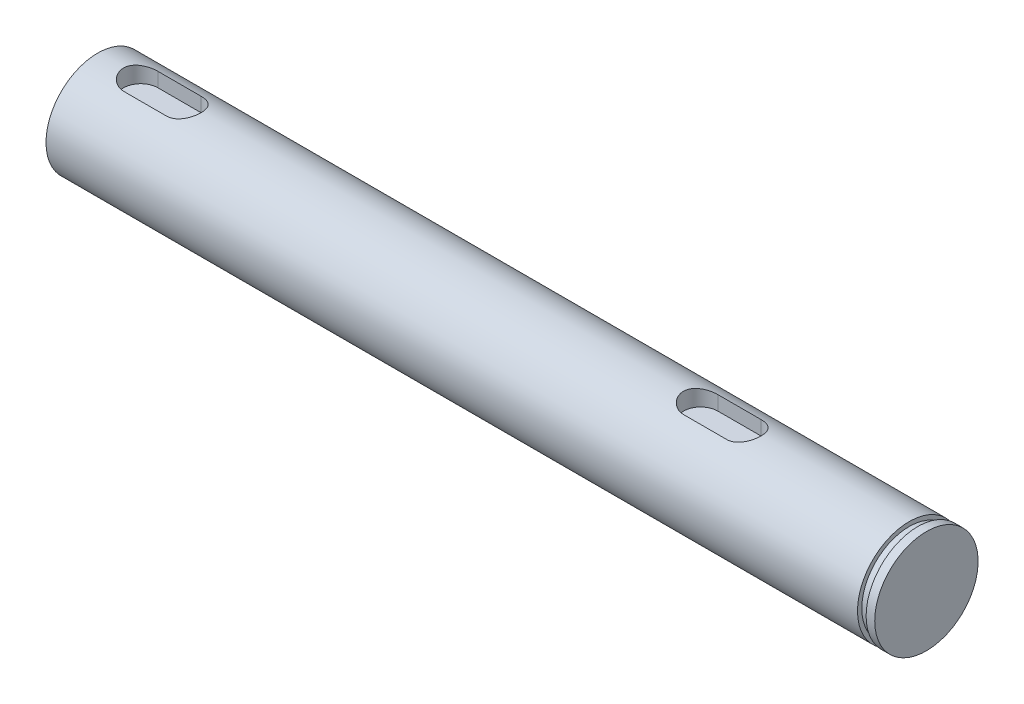
ISO-10303-21;
HEADER;
FILE_DESCRIPTION(('STEP AP214'),'2;1');
FILE_NAME('part.step','',(''),(''),'','','');
FILE_SCHEMA(('AUTOMOTIVE_DESIGN { 1 0 10303 214 1 1 1 1 }'));
ENDSEC;
DATA;
#1=APPLICATION_CONTEXT('core data for automotive mechanical design processes');
#2=APPLICATION_PROTOCOL_DEFINITION('international standard','automotive_design',2000,#1);
#3=PRODUCT_CONTEXT('',#1,'mechanical');
#4=PRODUCT('Part','Part','',(#3));
#5=PRODUCT_RELATED_PRODUCT_CATEGORY('part','',(#4));
#6=PRODUCT_DEFINITION_FORMATION('','',#4);
#7=PRODUCT_DEFINITION_CONTEXT('part definition',#1,'design');
#8=PRODUCT_DEFINITION('design','',#6,#7);
#9=PRODUCT_DEFINITION_SHAPE('','',#8);
#10=(LENGTH_UNIT() NAMED_UNIT(*) SI_UNIT(.MILLI.,.METRE.));
#11=(NAMED_UNIT(*) PLANE_ANGLE_UNIT() SI_UNIT($,.RADIAN.));
#12=(NAMED_UNIT(*) SI_UNIT($,.STERADIAN.) SOLID_ANGLE_UNIT());
#13=UNCERTAINTY_MEASURE_WITH_UNIT(LENGTH_MEASURE(1.E-05),#10,'distance_accuracy_value','');
#14=(GEOMETRIC_REPRESENTATION_CONTEXT(3) GLOBAL_UNCERTAINTY_ASSIGNED_CONTEXT((#13)) GLOBAL_UNIT_ASSIGNED_CONTEXT((#10,
#11,#12)) REPRESENTATION_CONTEXT('',''));
#15=CARTESIAN_POINT('',(0.,0.,0.));
#16=DIRECTION('',(0.,0.,1.));
#17=DIRECTION('',(1.,0.,0.));
#18=AXIS2_PLACEMENT_3D('',#15,#16,#17);
#19=CARTESIAN_POINT('',(0.,0.,0.));
#20=DIRECTION('',(-1.,0.,0.));
#21=DIRECTION('',(0.,0.,1.));
#22=AXIS2_PLACEMENT_3D('',#19,#20,#21);
#23=CYLINDRICAL_SURFACE('',#22,6.);
#24=CARTESIAN_POINT('',(96.2,0.,0.));
#25=DIRECTION('',(-1.,0.,0.));
#26=DIRECTION('',(0.,0.,1.));
#27=AXIS2_PLACEMENT_3D('',#24,#25,#26);
#28=CIRCLE('',#27,6.);
#29=CARTESIAN_POINT('',(96.2,0.,6.));
#30=VERTEX_POINT('',#29);
#31=EDGE_CURVE('E146',#30,#30,#28,.T.);
#32=ORIENTED_EDGE('',*,*,#31,.T.);
#33=EDGE_LOOP('',(#32));
#34=FACE_BOUND('',#33,.T.);
#35=CARTESIAN_POINT('',(95.2,0.,0.));
#36=DIRECTION('',(-1.,0.,0.));
#37=DIRECTION('',(0.,0.,1.));
#38=AXIS2_PLACEMENT_3D('',#35,#36,#37);
#39=CIRCLE('',#38,6.);
#40=CARTESIAN_POINT('',(95.2,0.,6.));
#41=VERTEX_POINT('',#40);
#42=EDGE_CURVE('E168',#41,#41,#39,.T.);
#43=ORIENTED_EDGE('',*,*,#42,.F.);
#44=EDGE_LOOP('',(#43));
#45=FACE_BOUND('',#44,.T.);
#46=ADVANCED_FACE('F36',(#34,#45),#23,.T.);
#47=CARTESIAN_POINT('',(95.2,0.,0.));
#48=DIRECTION('',(1.,0.,0.));
#49=DIRECTION('',(0.,0.,-1.));
#50=AXIS2_PLACEMENT_3D('',#47,#48,#49);
#51=PLANE('',#50);
#52=CARTESIAN_POINT('',(95.2,0.,0.));
#53=DIRECTION('',(-1.,0.,0.));
#54=DIRECTION('',(0.,0.,1.));
#55=AXIS2_PLACEMENT_3D('',#52,#53,#54);
#56=CIRCLE('',#55,5.5);
#57=CARTESIAN_POINT('',(95.2,0.,5.5));
#58=VERTEX_POINT('',#57);
#59=EDGE_CURVE('E165',#58,#58,#56,.T.);
#60=ORIENTED_EDGE('',*,*,#59,.F.);
#61=EDGE_LOOP('',(#60));
#62=FACE_BOUND('',#61,.T.);
#63=ORIENTED_EDGE('',*,*,#42,.T.);
#64=EDGE_LOOP('',(#63));
#65=FACE_BOUND('',#64,.T.);
#66=ADVANCED_FACE('F38',(#62,#65),#51,.F.);
#67=CARTESIAN_POINT('',(0.,0.,0.));
#68=DIRECTION('',(-1.,0.,0.));
#69=DIRECTION('',(0.,0.,1.));
#70=AXIS2_PLACEMENT_3D('',#67,#68,#69);
#71=CYLINDRICAL_SURFACE('',#70,5.5);
#72=ORIENTED_EDGE('',*,*,#59,.T.);
#73=EDGE_LOOP('',(#72));
#74=FACE_BOUND('',#73,.T.);
#75=CARTESIAN_POINT('',(94.2,0.,0.));
#76=DIRECTION('',(-1.,0.,0.));
#77=DIRECTION('',(0.,0.,1.));
#78=AXIS2_PLACEMENT_3D('',#75,#76,#77);
#79=CIRCLE('',#78,5.5);
#80=CARTESIAN_POINT('',(94.2,0.,5.5));
#81=VERTEX_POINT('',#80);
#82=EDGE_CURVE('E162',#81,#81,#79,.T.);
#83=ORIENTED_EDGE('',*,*,#82,.F.);
#84=EDGE_LOOP('',(#83));
#85=FACE_BOUND('',#84,.T.);
#86=ADVANCED_FACE('F257',(#74,#85),#71,.T.);
#87=CARTESIAN_POINT('',(94.2,0.,0.));
#88=DIRECTION('',(1.,0.,0.));
#89=DIRECTION('',(0.,0.,-1.));
#90=AXIS2_PLACEMENT_3D('',#87,#88,#89);
#91=PLANE('',#90);
#92=ORIENTED_EDGE('',*,*,#82,.T.);
#93=EDGE_LOOP('',(#92));
#94=FACE_BOUND('',#93,.T.);
#95=CARTESIAN_POINT('',(94.2,0.,0.));
#96=DIRECTION('',(-1.,0.,0.));
#97=DIRECTION('',(0.,0.,1.));
#98=AXIS2_PLACEMENT_3D('',#95,#96,#97);
#99=CIRCLE('',#98,6.);
#100=CARTESIAN_POINT('',(94.2,0.,6.));
#101=VERTEX_POINT('',#100);
#102=EDGE_CURVE('E159',#101,#101,#99,.T.);
#103=ORIENTED_EDGE('',*,*,#102,.F.);
#104=EDGE_LOOP('',(#103));
#105=FACE_BOUND('',#104,.T.);
#106=ADVANCED_FACE('F238',(#94,#105),#91,.T.);
#107=CARTESIAN_POINT('',(70.,5.65685424949238,-2.));
#108=CARTESIAN_POINT('',(69.9454190063978,5.65684884188678,-2.00000149491839));
#109=CARTESIAN_POINT('',(69.8908658756213,5.6576451988649,-1.99776424917478));
#110=CARTESIAN_POINT('',(69.7821828318902,5.66078654578442,-1.9888512140728));
#111=CARTESIAN_POINT('',(69.7280528086806,5.66313111768244,-1.98217662286705));
#112=CARTESIAN_POINT('',(69.5672157136097,5.67238184449302,-1.95562135046158));
#113=CARTESIAN_POINT('',(69.4616383074591,5.6815058499903,-1.92920846605623));
#114=CARTESIAN_POINT('',(69.2567496151125,5.70456149397718,-1.85991682366086));
#115=CARTESIAN_POINT('',(69.1574349062542,5.71849047905858,-1.81704715197507));
#116=CARTESIAN_POINT('',(68.9673203319891,5.74957574438921,-1.71614645792974));
#117=CARTESIAN_POINT('',(68.8765257418653,5.76673400456216,-1.65810612564547));
#118=CARTESIAN_POINT('',(68.7025595373509,5.80308960804095,-1.52610278704602));
#119=CARTESIAN_POINT('',(68.6197702390748,5.82233755536618,-1.45164996064407));
#120=CARTESIAN_POINT('',(68.4675879644166,5.86027697385956,-1.28997688598296));
#121=CARTESIAN_POINT('',(68.3981973734881,5.87896834543706,-1.20275436910907));
#122=CARTESIAN_POINT('',(68.2730409623916,5.91427765988454,-1.01520729191253));
#123=CARTESIAN_POINT('',(68.2176780311955,5.93082875123708,-0.914600178716993));
#124=CARTESIAN_POINT('',(68.1248154966255,5.95939217209316,-0.704858499931718));
#125=CARTESIAN_POINT('',(68.0873104363591,5.97140588786619,-0.595726551186838));
#126=CARTESIAN_POINT('',(68.0325285478173,5.98918142285845,-0.376058690956072));
#127=CARTESIAN_POINT('',(68.0145934548926,5.99514617977147,-0.265703668920225));
#128=CARTESIAN_POINT('',(67.9973674029488,6.00087216807634,-0.0433979389113492));
#129=CARTESIAN_POINT('',(67.9980720014605,6.00063487762605,0.068552382490781));
#130=CARTESIAN_POINT('',(68.0176885662133,5.99412077270532,0.286207690558781));
#131=CARTESIAN_POINT('',(68.0358852759189,5.98808121982527,0.39198540525107));
#132=CARTESIAN_POINT('',(68.0887863973482,5.97093921001647,0.59888812875331));
#133=CARTESIAN_POINT('',(68.1234917244125,5.95983647235462,0.700012879232926));
#134=CARTESIAN_POINT('',(68.2088427392013,5.93351336542608,0.896305246061921));
#135=CARTESIAN_POINT('',(68.2596920902447,5.91824075676625,0.991377011307979));
#136=CARTESIAN_POINT('',(68.3757199027814,5.88516775360088,1.17184917819497));
#137=CARTESIAN_POINT('',(68.440902262093,5.86736667195186,1.25724693942937));
#138=CARTESIAN_POINT('',(68.5873420999937,5.83012543885479,1.42019467942242));
#139=CARTESIAN_POINT('',(68.6692110872194,5.81064757359828,1.4971872232254));
#140=CARTESIAN_POINT('',(68.8448829794323,5.77294980945702,1.63654404964077));
#141=CARTESIAN_POINT('',(68.9386897248065,5.75473031831506,1.69890360636763));
#142=CARTESIAN_POINT('',(69.1373603567066,5.72140062752635,1.80800665118557));
#143=CARTESIAN_POINT('',(69.2423670298659,5.70634029896469,1.85450601901536));
#144=CARTESIAN_POINT('',(69.4592939551799,5.68162194124078,1.92892046140223));
#145=CARTESIAN_POINT('',(69.5712029867443,5.67195538817986,1.95686487211071));
#146=CARTESIAN_POINT('',(69.736837273496,5.6627308418944,1.98331631256166));
#147=CARTESIAN_POINT('',(69.7892827797084,5.66053335389204,1.98957012251023));
#148=CARTESIAN_POINT('',(69.8944761567996,5.65759407142798,1.99790923214239));
#149=CARTESIAN_POINT('',(69.9472235490888,5.65685039859056,1.99999991078996));
#150=CARTESIAN_POINT('',(70.,5.65685424949238,2.));
#151=B_SPLINE_CURVE_WITH_KNOTS('',3,(#107,#108,#109,#110,#111,#112,#113,#114,#115,#116,#117,
#118,#119,#120,#121,#122,#123,#124,#125,#126,#127,#128,#129,#130,#131,#132,#133,#134,#135,#136,
#137,#138,#139,#140,#141,#142,#143,#144,#145,#146,#147,#148,#149,#150),.UNSPECIFIED.,.F.,.F.,(4,
2,2,2,2,2,2,2,2,2,2,2,2,2,2,2,2,2,2,2,2,4),(0.,0.163636969470867,0.327229772338933,
0.653162396790742,0.978915321932481,1.30486862627062,1.64233009925356,1.97985159727495,
2.32618265866203,2.67240782242254,3.00658941454805,3.34069136061284,3.6616883693147,
3.98270317816495,4.30794037651935,4.63326613177537,4.973881081161,5.31460588498485,
5.6603605985608,6.00556734973677,6.16399790665502,6.32222363058113),.UNSPECIFIED.);
#152=CARTESIAN_POINT('',(70.,5.65685424949238,-2.));
#153=VERTEX_POINT('',#152);
#154=CARTESIAN_POINT('',(70.,5.65685424949238,2.));
#155=VERTEX_POINT('',#154);
#156=EDGE_CURVE('E209',#153,#155,#151,.T.);
#157=ORIENTED_EDGE('',*,*,#156,.F.);
#158=DIRECTION('',(-1.,0.,0.));
#159=VECTOR('',#158,1.);
#160=CARTESIAN_POINT('',(0.,5.65685424949238,-1.99999999999999));
#161=LINE('',#160,#159);
#162=CARTESIAN_POINT('',(75.,5.65685424949238,-2.));
#163=VERTEX_POINT('',#162);
#164=EDGE_CURVE('E11',#163,#153,#161,.T.);
#165=ORIENTED_EDGE('',*,*,#164,.F.);
#166=CARTESIAN_POINT('',(75.,5.65685424949238,2.));
#167=CARTESIAN_POINT('',(75.0545809936023,5.65684884188678,2.0000014949184));
#168=CARTESIAN_POINT('',(75.1091341243787,5.6576451988649,1.99776424917478));
#169=CARTESIAN_POINT('',(75.2178171681098,5.66078654578442,1.9888512140728));
#170=CARTESIAN_POINT('',(75.2719471913194,5.66313111768244,1.98217662286705));
#171=CARTESIAN_POINT('',(75.4327842863903,5.67238184449301,1.95562135046158));
#172=CARTESIAN_POINT('',(75.538361692541,5.6815058499903,1.92920846605623));
#173=CARTESIAN_POINT('',(75.7432503848876,5.70456149397718,1.85991682366086));
#174=CARTESIAN_POINT('',(75.8425650937459,5.71849047905858,1.81704715197507));
#175=CARTESIAN_POINT('',(76.0326796680109,5.74957574438921,1.71614645792974));
#176=CARTESIAN_POINT('',(76.1234742581347,5.76673400456216,1.65810612564547));
#177=CARTESIAN_POINT('',(76.2974404626491,5.80308960804095,1.52610278704602));
#178=CARTESIAN_POINT('',(76.3802297609252,5.82233755536618,1.45164996064407));
#179=CARTESIAN_POINT('',(76.5324120355834,5.86027697385956,1.28997688598296));
#180=CARTESIAN_POINT('',(76.6018026265119,5.87896834543706,1.20275436910907));
#181=CARTESIAN_POINT('',(76.7269590376084,5.91427765988454,1.01520729191253));
#182=CARTESIAN_POINT('',(76.7823219688045,5.93082875123708,0.914600178716994));
#183=CARTESIAN_POINT('',(76.8751845033746,5.95939217209316,0.704858499931719));
#184=CARTESIAN_POINT('',(76.9126895636409,5.97140588786619,0.595726551186839));
#185=CARTESIAN_POINT('',(76.9674714521827,5.98918142285845,0.376058690956073));
#186=CARTESIAN_POINT('',(76.9854065451074,5.99514617977147,0.265703668920225));
#187=CARTESIAN_POINT('',(77.0026325970512,6.00087216807634,0.0433979389113496));
#188=CARTESIAN_POINT('',(77.0019279985395,6.00063487762605,-0.0685523824907803));
#189=CARTESIAN_POINT('',(76.9823114337867,5.99412077270532,-0.28620769055878));
#190=CARTESIAN_POINT('',(76.9641147240811,5.98808121982527,-0.391985405251069));
#191=CARTESIAN_POINT('',(76.9112136026518,5.97093921001647,-0.598888128753309));
#192=CARTESIAN_POINT('',(76.8765082755875,5.95983647235462,-0.700012879232925));
#193=CARTESIAN_POINT('',(76.7911572607988,5.93351336542608,-0.89630524606192));
#194=CARTESIAN_POINT('',(76.7403079097553,5.91824075676625,-0.991377011307978));
#195=CARTESIAN_POINT('',(76.6242800972186,5.88516775360088,-1.17184917819497));
#196=CARTESIAN_POINT('',(76.559097737907,5.86736667195186,-1.25724693942937));
#197=CARTESIAN_POINT('',(76.4126579000063,5.83012543885479,-1.42019467942242));
#198=CARTESIAN_POINT('',(76.3307889127806,5.81064757359828,-1.4971872232254));
#199=CARTESIAN_POINT('',(76.1551170205677,5.77294980945702,-1.63654404964076));
#200=CARTESIAN_POINT('',(76.0613102751935,5.75473031831506,-1.69890360636762));
#201=CARTESIAN_POINT('',(75.8626396432935,5.72140062752635,-1.80800665118556));
#202=CARTESIAN_POINT('',(75.7576329701341,5.70634029896469,-1.85450601901536));
#203=CARTESIAN_POINT('',(75.5407060448201,5.68162194124078,-1.92892046140223));
#204=CARTESIAN_POINT('',(75.4287970132557,5.67195538817986,-1.95686487211071));
#205=CARTESIAN_POINT('',(75.263162726504,5.6627308418944,-1.98331631256166));
#206=CARTESIAN_POINT('',(75.2107172202916,5.66053335389204,-1.98957012251023));
#207=CARTESIAN_POINT('',(75.1055238432004,5.65759407142798,-1.99790923214239));
#208=CARTESIAN_POINT('',(75.0527764509112,5.65685039859056,-1.99999991078996));
#209=CARTESIAN_POINT('',(75.,5.65685424949238,-2.));
#210=B_SPLINE_CURVE_WITH_KNOTS('',3,(#166,#167,#168,#169,#170,#171,#172,#173,#174,#175,#176,
#177,#178,#179,#180,#181,#182,#183,#184,#185,#186,#187,#188,#189,#190,#191,#192,#193,#194,#195,
#196,#197,#198,#199,#200,#201,#202,#203,#204,#205,#206,#207,#208,#209),.UNSPECIFIED.,.F.,.F.,(4,
2,2,2,2,2,2,2,2,2,2,2,2,2,2,2,2,2,2,2,2,4),(0.,0.163636969470867,0.327229772338933,
0.653162396790742,0.978915321932481,1.30486862627062,1.64233009925356,1.97985159727495,
2.32618265866203,2.67240782242254,3.00658941454806,3.34069136061284,3.6616883693147,
3.98270317816495,4.30794037651935,4.63326613177537,4.973881081161,5.31460588498485,
5.6603605985608,6.00556734973678,6.16399790665503,6.32222363058113),.UNSPECIFIED.);
#211=CARTESIAN_POINT('',(75.,5.65685424949238,2.));
#212=VERTEX_POINT('',#211);
#213=EDGE_CURVE('E44',#212,#163,#210,.T.);
#214=ORIENTED_EDGE('',*,*,#213,.F.);
#215=DIRECTION('',(-1.,0.,0.));
#216=VECTOR('',#215,1.);
#217=CARTESIAN_POINT('',(0.,5.65685424949238,2.00000000000001));
#218=LINE('',#217,#216);
#219=EDGE_CURVE('E215',#155,#212,#218,.F.);
#220=ORIENTED_EDGE('',*,*,#219,.F.);
#221=EDGE_LOOP('',(#157,#165,#214,#220));
#222=FACE_BOUND('',#221,.T.);
#223=CARTESIAN_POINT('',(10.,5.65685424949238,2.));
#224=CARTESIAN_POINT('',(10.0545809936022,5.65684884188678,2.0000014949184));
#225=CARTESIAN_POINT('',(10.1091341243787,5.6576451988649,1.99776424917478));
#226=CARTESIAN_POINT('',(10.2178171681098,5.66078654578442,1.9888512140728));
#227=CARTESIAN_POINT('',(10.2719471913194,5.66313111768244,1.98217662286705));
#228=CARTESIAN_POINT('',(10.4327842863903,5.67238184449302,1.95562135046158));
#229=CARTESIAN_POINT('',(10.538361692541,5.6815058499903,1.92920846605623));
#230=CARTESIAN_POINT('',(10.7432503848876,5.70456149397718,1.85991682366086));
#231=CARTESIAN_POINT('',(10.8425650937458,5.71849047905858,1.81704715197507));
#232=CARTESIAN_POINT('',(11.0326796680109,5.74957574438921,1.71614645792974));
#233=CARTESIAN_POINT('',(11.1234742581347,5.76673400456216,1.65810612564547));
#234=CARTESIAN_POINT('',(11.2974404626491,5.80308960804095,1.52610278704602));
#235=CARTESIAN_POINT('',(11.3802297609252,5.82233755536618,1.45164996064407));
#236=CARTESIAN_POINT('',(11.5324120355834,5.86027697385956,1.28997688598296));
#237=CARTESIAN_POINT('',(11.6018026265119,5.87896834543706,1.20275436910907));
#238=CARTESIAN_POINT('',(11.7269590376084,5.91427765988454,1.01520729191252));
#239=CARTESIAN_POINT('',(11.7823219688045,5.93082875123708,0.91460017871699));
#240=CARTESIAN_POINT('',(11.8751845033745,5.95939217209317,0.704858499931715));
#241=CARTESIAN_POINT('',(11.9126895636409,5.97140588786619,0.595726551186836));
#242=CARTESIAN_POINT('',(11.9674714521827,5.98918142285845,0.37605869095607));
#243=CARTESIAN_POINT('',(11.9854065451074,5.99514617977147,0.26570366892022));
#244=CARTESIAN_POINT('',(12.0026325970512,6.00087216807633,0.0433979389113427));
#245=CARTESIAN_POINT('',(12.0019279985395,6.00063487762605,-0.0685523824907881));
#246=CARTESIAN_POINT('',(11.9823114337867,5.99412077270532,-0.286207690558788));
#247=CARTESIAN_POINT('',(11.9641147240811,5.98808121982527,-0.391985405251076));
#248=CARTESIAN_POINT('',(11.9112136026518,5.97093921001647,-0.598888128753315));
#249=CARTESIAN_POINT('',(11.8765082755875,5.95983647235462,-0.700012879232931));
#250=CARTESIAN_POINT('',(11.7911572607987,5.93351336542608,-0.896305246061928));
#251=CARTESIAN_POINT('',(11.7403079097553,5.91824075676625,-0.991377011307987));
#252=CARTESIAN_POINT('',(11.6242800972186,5.88516775360088,-1.17184917819498));
#253=CARTESIAN_POINT('',(11.559097737907,5.86736667195186,-1.25724693942937));
#254=CARTESIAN_POINT('',(11.4126579000063,5.83012543885479,-1.42019467942243));
#255=CARTESIAN_POINT('',(11.3307889127806,5.81064757359828,-1.4971872232254));
#256=CARTESIAN_POINT('',(11.1551170205677,5.77294980945702,-1.63654404964077));
#257=CARTESIAN_POINT('',(11.0613102751935,5.75473031831506,-1.69890360636763));
#258=CARTESIAN_POINT('',(10.8626396432934,5.72140062752635,-1.80800665118557));
#259=CARTESIAN_POINT('',(10.7576329701341,5.70634029896469,-1.85450601901537));
#260=CARTESIAN_POINT('',(10.5407060448201,5.68162194124078,-1.92892046140223));
#261=CARTESIAN_POINT('',(10.4287970132557,5.67195538817986,-1.95686487211071));
#262=CARTESIAN_POINT('',(10.263162726504,5.6627308418944,-1.98331631256166));
#263=CARTESIAN_POINT('',(10.2107172202915,5.66053335389204,-1.98957012251023));
#264=CARTESIAN_POINT('',(10.1055238432004,5.65759407142798,-1.99790923214239));
#265=CARTESIAN_POINT('',(10.0527764509112,5.65685039859056,-1.99999991078996));
#266=CARTESIAN_POINT('',(10.,5.65685424949238,-2.));
#267=B_SPLINE_CURVE_WITH_KNOTS('',3,(#223,#224,#225,#226,#227,#228,#229,#230,#231,#232,#233,
#234,#235,#236,#237,#238,#239,#240,#241,#242,#243,#244,#245,#246,#247,#248,#249,#250,#251,#252,
#253,#254,#255,#256,#257,#258,#259,#260,#261,#262,#263,#264,#265,#266),.UNSPECIFIED.,.F.,.F.,(4,
2,2,2,2,2,2,2,2,2,2,2,2,2,2,2,2,2,2,2,2,4),(0.,0.163636969470867,0.327229772338924,
0.653162396790747,0.978915321932474,1.30486862627062,1.64233009925355,1.97985159727495,
2.32618265866203,2.67240782242255,3.00658941454806,3.34069136061285,3.6616883693147,
3.98270317816496,4.30794037651936,4.63326613177537,4.97388108116101,5.31460588498485,
5.6603605985608,6.00556734973678,6.16399790665503,6.32222363058113),.UNSPECIFIED.);
#268=CARTESIAN_POINT('',(10.,5.65685424949238,2.));
#269=VERTEX_POINT('',#268);
#270=CARTESIAN_POINT('',(10.,5.65685424949238,-2.));
#271=VERTEX_POINT('',#270);
#272=EDGE_CURVE('E171',#269,#271,#267,.T.);
#273=ORIENTED_EDGE('',*,*,#272,.F.);
#274=DIRECTION('',(-1.,0.,0.));
#275=VECTOR('',#274,1.);
#276=CARTESIAN_POINT('',(0.,5.65685424949238,2.));
#277=LINE('',#276,#275);
#278=CARTESIAN_POINT('',(5.,5.65685424949238,2.));
#279=VERTEX_POINT('',#278);
#280=EDGE_CURVE('E207',#279,#269,#277,.F.);
#281=ORIENTED_EDGE('',*,*,#280,.F.);
#282=CARTESIAN_POINT('',(5.,5.65685424949238,-2.));
#283=CARTESIAN_POINT('',(4.94541900639777,5.65684884188678,-2.0000014949184));
#284=CARTESIAN_POINT('',(4.89086587562134,5.6576451988649,-1.99776424917478));
#285=CARTESIAN_POINT('',(4.78218283189021,5.66078654578442,-1.9888512140728));
#286=CARTESIAN_POINT('',(4.72805280868061,5.66313111768244,-1.98217662286705));
#287=CARTESIAN_POINT('',(4.56721571360972,5.67238184449301,-1.95562135046158));
#288=CARTESIAN_POINT('',(4.46163830745904,5.6815058499903,-1.92920846605623));
#289=CARTESIAN_POINT('',(4.25674961511244,5.70456149397718,-1.85991682366086));
#290=CARTESIAN_POINT('',(4.15743490625415,5.71849047905858,-1.81704715197507));
#291=CARTESIAN_POINT('',(3.96732033198908,5.74957574438921,-1.71614645792974));
#292=CARTESIAN_POINT('',(3.8765257418653,5.76673400456216,-1.65810612564547));
#293=CARTESIAN_POINT('',(3.70255953735094,5.80308960804095,-1.52610278704602));
#294=CARTESIAN_POINT('',(3.61977023907478,5.82233755536618,-1.45164996064407));
#295=CARTESIAN_POINT('',(3.46758796441661,5.86027697385956,-1.28997688598296));
#296=CARTESIAN_POINT('',(3.39819737348812,5.87896834543706,-1.20275436910907));
#297=CARTESIAN_POINT('',(3.2730409623916,5.91427765988454,-1.01520729191253));
#298=CARTESIAN_POINT('',(3.21767803119549,5.93082875123708,-0.914600178716992));
#299=CARTESIAN_POINT('',(3.12481549662547,5.95939217209316,-0.704858499931718));
#300=CARTESIAN_POINT('',(3.08731043635913,5.97140588786619,-0.59572655118684));
#301=CARTESIAN_POINT('',(3.03252854781725,5.98918142285845,-0.376058690956073));
#302=CARTESIAN_POINT('',(3.01459345489264,5.99514617977147,-0.265703668920224));
#303=CARTESIAN_POINT('',(2.99736740294878,6.00087216807633,-0.0433979389113456));
#304=CARTESIAN_POINT('',(2.9980720014605,6.00063487762605,0.0685523824907852));
#305=CARTESIAN_POINT('',(3.01768856621331,5.99412077270532,0.286207690558785));
#306=CARTESIAN_POINT('',(3.03588527591893,5.98808121982527,0.391985405251073));
#307=CARTESIAN_POINT('',(3.08878639734824,5.97093921001647,0.598888128753313));
#308=CARTESIAN_POINT('',(3.12349172441251,5.95983647235462,0.700012879232929));
#309=CARTESIAN_POINT('',(3.20884273920126,5.93351336542608,0.896305246061925));
#310=CARTESIAN_POINT('',(3.25969209024468,5.91824075676625,0.991377011307985));
#311=CARTESIAN_POINT('',(3.3757199027814,5.88516775360088,1.17184917819498));
#312=CARTESIAN_POINT('',(3.44090226209303,5.86736667195186,1.25724693942937));
#313=CARTESIAN_POINT('',(3.58734209999369,5.83012543885479,1.42019467942242));
#314=CARTESIAN_POINT('',(3.66921108721941,5.81064757359828,1.4971872232254));
#315=CARTESIAN_POINT('',(3.84488297943233,5.77294980945702,1.63654404964077));
#316=CARTESIAN_POINT('',(3.93868972480648,5.75473031831506,1.69890360636763));
#317=CARTESIAN_POINT('',(4.13736035670656,5.72140062752635,1.80800665118557));
#318=CARTESIAN_POINT('',(4.24236702986588,5.70634029896469,1.85450601901537));
#319=CARTESIAN_POINT('',(4.45929395517991,5.68162194124078,1.92892046140223));
#320=CARTESIAN_POINT('',(4.5712029867443,5.67195538817985,1.95686487211071));
#321=CARTESIAN_POINT('',(4.73683727349596,5.6627308418944,1.98331631256166));
#322=CARTESIAN_POINT('',(4.78928277970845,5.66053335389204,1.98957012251023));
#323=CARTESIAN_POINT('',(4.89447615679963,5.65759407142798,1.99790923214239));
#324=CARTESIAN_POINT('',(4.94722354908881,5.65685039859056,1.99999991078996));
#325=CARTESIAN_POINT('',(5.,5.65685424949238,2.));
#326=B_SPLINE_CURVE_WITH_KNOTS('',3,(#282,#283,#284,#285,#286,#287,#288,#289,#290,#291,#292,
#293,#294,#295,#296,#297,#298,#299,#300,#301,#302,#303,#304,#305,#306,#307,#308,#309,#310,#311,
#312,#313,#314,#315,#316,#317,#318,#319,#320,#321,#322,#323,#324,#325),.UNSPECIFIED.,.F.,.F.,(4,
2,2,2,2,2,2,2,2,2,2,2,2,2,2,2,2,2,2,2,2,4),(0.,0.163636969470865,0.327229772338923,
0.653162396790746,0.978915321932474,1.30486862627062,1.64233009925355,1.97985159727495,
2.32618265866203,2.67240782242254,3.00658941454806,3.34069136061285,3.6616883693147,
3.98270317816496,4.30794037651935,4.63326613177537,4.973881081161,5.31460588498485,
5.6603605985608,6.00556734973678,6.16399790665503,6.32222363058113),.UNSPECIFIED.);
#327=CARTESIAN_POINT('',(5.,5.65685424949238,-2.));
#328=VERTEX_POINT('',#327);
#329=EDGE_CURVE('E202',#328,#279,#326,.T.);
#330=ORIENTED_EDGE('',*,*,#329,.F.);
#331=DIRECTION('',(-1.,0.,0.));
#332=VECTOR('',#331,1.);
#333=CARTESIAN_POINT('',(0.,5.65685424949238,-2.));
#334=LINE('',#333,#332);
#335=EDGE_CURVE('E178',#271,#328,#334,.T.);
#336=ORIENTED_EDGE('',*,*,#335,.F.);
#337=EDGE_LOOP('',(#273,#281,#330,#336));
#338=FACE_BOUND('',#337,.T.);
#339=ORIENTED_EDGE('',*,*,#102,.T.);
#340=EDGE_LOOP('',(#339));
#341=FACE_BOUND('',#340,.T.);
#342=CARTESIAN_POINT('',(0.,0.,0.));
#343=DIRECTION('',(-1.,0.,0.));
#344=DIRECTION('',(0.,0.,1.));
#345=AXIS2_PLACEMENT_3D('',#342,#343,#344);
#346=CIRCLE('',#345,6.);
#347=CARTESIAN_POINT('',(0.,0.,6.));
#348=VERTEX_POINT('',#347);
#349=EDGE_CURVE('E156',#348,#348,#346,.T.);
#350=ORIENTED_EDGE('',*,*,#349,.F.);
#351=EDGE_LOOP('',(#350));
#352=FACE_BOUND('',#351,.T.);
#353=ADVANCED_FACE('F180',(#222,#338,#341,#352),#23,.T.);
#354=CARTESIAN_POINT('',(0.,0.,0.));
#355=DIRECTION('',(-1.,0.,0.));
#356=DIRECTION('',(0.,0.,1.));
#357=AXIS2_PLACEMENT_3D('',#354,#355,#356);
#358=PLANE('',#357);
#359=ORIENTED_EDGE('',*,*,#349,.T.);
#360=EDGE_LOOP('',(#359));
#361=FACE_BOUND('',#360,.T.);
#362=ADVANCED_FACE('F237',(#361),#358,.T.);
#363=CARTESIAN_POINT('',(96.2,0.,0.));
#364=DIRECTION('',(-1.,0.,0.));
#365=DIRECTION('',(0.,0.,1.));
#366=AXIS2_PLACEMENT_3D('',#363,#364,#365);
#367=PLANE('',#366);
#368=ORIENTED_EDGE('',*,*,#31,.F.);
#369=EDGE_LOOP('',(#368));
#370=FACE_BOUND('',#369,.T.);
#371=ADVANCED_FACE('F200',(#370),#367,.F.);
#372=CARTESIAN_POINT('',(5.,4.,0.));
#373=DIRECTION('',(0.,1.,0.));
#374=DIRECTION('',(0.,0.,1.));
#375=AXIS2_PLACEMENT_3D('',#372,#373,#374);
#376=CYLINDRICAL_SURFACE('',#375,2.);
#377=DIRECTION('',(0.,1.,0.));
#378=VECTOR('',#377,1.);
#379=CARTESIAN_POINT('',(5.,4.,-2.));
#380=LINE('',#379,#378);
#381=CARTESIAN_POINT('',(5.,4.,-2.));
#382=VERTEX_POINT('',#381);
#383=EDGE_CURVE('E143',#382,#328,#380,.T.);
#384=ORIENTED_EDGE('',*,*,#383,.T.);
#385=ORIENTED_EDGE('',*,*,#329,.T.);
#386=DIRECTION('',(0.,1.,0.));
#387=VECTOR('',#386,1.);
#388=CARTESIAN_POINT('',(5.,4.,2.));
#389=LINE('',#388,#387);
#390=CARTESIAN_POINT('',(5.,4.,2.));
#391=VERTEX_POINT('',#390);
#392=EDGE_CURVE('E58',#391,#279,#389,.T.);
#393=ORIENTED_EDGE('',*,*,#392,.F.);
#394=CARTESIAN_POINT('',(5.,4.,0.));
#395=DIRECTION('',(0.,1.,0.));
#396=DIRECTION('',(0.,0.,1.));
#397=AXIS2_PLACEMENT_3D('',#394,#395,#396);
#398=CIRCLE('',#397,2.);
#399=EDGE_CURVE('E127',#382,#391,#398,.T.);
#400=ORIENTED_EDGE('',*,*,#399,.F.);
#401=EDGE_LOOP('',(#384,#385,#393,#400));
#402=FACE_BOUND('',#401,.T.);
#403=ADVANCED_FACE('F196',(#402),#376,.F.);
#404=CARTESIAN_POINT('',(5.,4.,-2.));
#405=DIRECTION('',(0.,0.,-1.));
#406=DIRECTION('',(-1.,0.,0.));
#407=AXIS2_PLACEMENT_3D('',#404,#405,#406);
#408=PLANE('',#407);
#409=ORIENTED_EDGE('',*,*,#335,.T.);
#410=ORIENTED_EDGE('',*,*,#383,.F.);
#411=DIRECTION('',(-1.,0.,0.));
#412=VECTOR('',#411,1.);
#413=CARTESIAN_POINT('',(5.,4.,-2.));
#414=LINE('',#413,#412);
#415=CARTESIAN_POINT('',(10.,4.,-2.));
#416=VERTEX_POINT('',#415);
#417=EDGE_CURVE('E140',#416,#382,#414,.T.);
#418=ORIENTED_EDGE('',*,*,#417,.F.);
#419=DIRECTION('',(0.,1.,0.));
#420=VECTOR('',#419,1.);
#421=CARTESIAN_POINT('',(10.,4.,-2.));
#422=LINE('',#421,#420);
#423=EDGE_CURVE('E147',#416,#271,#422,.T.);
#424=ORIENTED_EDGE('',*,*,#423,.T.);
#425=EDGE_LOOP('',(#409,#410,#418,#424));
#426=FACE_BOUND('',#425,.T.);
#427=ADVANCED_FACE('F190',(#426),#408,.F.);
#428=CARTESIAN_POINT('',(10.,4.,0.));
#429=DIRECTION('',(0.,1.,0.));
#430=DIRECTION('',(0.,0.,1.));
#431=AXIS2_PLACEMENT_3D('',#428,#429,#430);
#432=CYLINDRICAL_SURFACE('',#431,2.);
#433=DIRECTION('',(0.,1.,0.));
#434=VECTOR('',#433,1.);
#435=CARTESIAN_POINT('',(10.,4.,2.));
#436=LINE('',#435,#434);
#437=CARTESIAN_POINT('',(10.,4.,2.));
#438=VERTEX_POINT('',#437);
#439=EDGE_CURVE('E150',#438,#269,#436,.T.);
#440=ORIENTED_EDGE('',*,*,#439,.T.);
#441=ORIENTED_EDGE('',*,*,#272,.T.);
#442=ORIENTED_EDGE('',*,*,#423,.F.);
#443=CARTESIAN_POINT('',(10.,4.,0.));
#444=DIRECTION('',(0.,1.,0.));
#445=DIRECTION('',(0.,0.,1.));
#446=AXIS2_PLACEMENT_3D('',#443,#444,#445);
#447=CIRCLE('',#446,2.);
#448=EDGE_CURVE('E137',#438,#416,#447,.T.);
#449=ORIENTED_EDGE('',*,*,#448,.F.);
#450=EDGE_LOOP('',(#440,#441,#442,#449));
#451=FACE_BOUND('',#450,.T.);
#452=ADVANCED_FACE('F184',(#451),#432,.F.);
#453=CARTESIAN_POINT('',(5.,4.,2.));
#454=DIRECTION('',(0.,0.,1.));
#455=DIRECTION('',(1.,0.,0.));
#456=AXIS2_PLACEMENT_3D('',#453,#454,#455);
#457=PLANE('',#456);
#458=ORIENTED_EDGE('',*,*,#280,.T.);
#459=ORIENTED_EDGE('',*,*,#439,.F.);
#460=DIRECTION('',(1.,0.,0.));
#461=VECTOR('',#460,1.);
#462=CARTESIAN_POINT('',(5.,4.,2.));
#463=LINE('',#462,#461);
#464=EDGE_CURVE('E134',#391,#438,#463,.T.);
#465=ORIENTED_EDGE('',*,*,#464,.F.);
#466=ORIENTED_EDGE('',*,*,#392,.T.);
#467=EDGE_LOOP('',(#458,#459,#465,#466));
#468=FACE_BOUND('',#467,.T.);
#469=ADVANCED_FACE('F189',(#468),#457,.F.);
#470=CARTESIAN_POINT('',(5.,4.,0.));
#471=DIRECTION('',(0.,1.,0.));
#472=DIRECTION('',(0.,0.,1.));
#473=AXIS2_PLACEMENT_3D('',#470,#471,#472);
#474=PLANE('',#473);
#475=ORIENTED_EDGE('',*,*,#399,.T.);
#476=ORIENTED_EDGE('',*,*,#464,.T.);
#477=ORIENTED_EDGE('',*,*,#448,.T.);
#478=ORIENTED_EDGE('',*,*,#417,.T.);
#479=EDGE_LOOP('',(#475,#476,#477,#478));
#480=FACE_BOUND('',#479,.T.);
#481=ADVANCED_FACE('F195',(#480),#474,.T.);
#482=CARTESIAN_POINT('',(75.,4.,0.));
#483=DIRECTION('',(0.,1.,0.));
#484=DIRECTION('',(0.,0.,1.));
#485=AXIS2_PLACEMENT_3D('',#482,#483,#484);
#486=CYLINDRICAL_SURFACE('',#485,2.);
#487=DIRECTION('',(0.,1.,0.));
#488=VECTOR('',#487,1.);
#489=CARTESIAN_POINT('',(75.,4.,2.));
#490=LINE('',#489,#488);
#491=CARTESIAN_POINT('',(75.,4.,2.));
#492=VERTEX_POINT('',#491);
#493=EDGE_CURVE('E125',#492,#212,#490,.T.);
#494=ORIENTED_EDGE('',*,*,#493,.T.);
#495=ORIENTED_EDGE('',*,*,#213,.T.);
#496=DIRECTION('',(0.,1.,0.));
#497=VECTOR('',#496,1.);
#498=CARTESIAN_POINT('',(75.,4.,-2.));
#499=LINE('',#498,#497);
#500=CARTESIAN_POINT('',(75.,4.,-2.));
#501=VERTEX_POINT('',#500);
#502=EDGE_CURVE('E50',#501,#163,#499,.T.);
#503=ORIENTED_EDGE('',*,*,#502,.F.);
#504=CARTESIAN_POINT('',(75.,4.,0.));
#505=DIRECTION('',(0.,1.,0.));
#506=DIRECTION('',(0.,0.,1.));
#507=AXIS2_PLACEMENT_3D('',#504,#505,#506);
#508=CIRCLE('',#507,2.);
#509=EDGE_CURVE('E104',#492,#501,#508,.T.);
#510=ORIENTED_EDGE('',*,*,#509,.F.);
#511=EDGE_LOOP('',(#494,#495,#503,#510));
#512=FACE_BOUND('',#511,.T.);
#513=ADVANCED_FACE('F102',(#512),#486,.F.);
#514=CARTESIAN_POINT('',(75.,4.,2.));
#515=DIRECTION('',(0.,0.,1.));
#516=DIRECTION('',(1.,0.,0.));
#517=AXIS2_PLACEMENT_3D('',#514,#515,#516);
#518=PLANE('',#517);
#519=ORIENTED_EDGE('',*,*,#219,.T.);
#520=ORIENTED_EDGE('',*,*,#493,.F.);
#521=DIRECTION('',(1.,0.,0.));
#522=VECTOR('',#521,1.);
#523=CARTESIAN_POINT('',(75.,4.,2.));
#524=LINE('',#523,#522);
#525=CARTESIAN_POINT('',(70.,4.,2.));
#526=VERTEX_POINT('',#525);
#527=EDGE_CURVE('E108',#526,#492,#524,.T.);
#528=ORIENTED_EDGE('',*,*,#527,.F.);
#529=DIRECTION('',(0.,1.,0.));
#530=VECTOR('',#529,1.);
#531=CARTESIAN_POINT('',(70.,4.,2.));
#532=LINE('',#531,#530);
#533=EDGE_CURVE('E128',#526,#155,#532,.T.);
#534=ORIENTED_EDGE('',*,*,#533,.T.);
#535=EDGE_LOOP('',(#519,#520,#528,#534));
#536=FACE_BOUND('',#535,.T.);
#537=ADVANCED_FACE('F221',(#536),#518,.F.);
#538=CARTESIAN_POINT('',(70.,4.,0.));
#539=DIRECTION('',(0.,1.,0.));
#540=DIRECTION('',(0.,0.,1.));
#541=AXIS2_PLACEMENT_3D('',#538,#539,#540);
#542=CYLINDRICAL_SURFACE('',#541,2.);
#543=DIRECTION('',(0.,1.,0.));
#544=VECTOR('',#543,1.);
#545=CARTESIAN_POINT('',(70.,4.,-2.));
#546=LINE('',#545,#544);
#547=CARTESIAN_POINT('',(70.,4.,-2.));
#548=VERTEX_POINT('',#547);
#549=EDGE_CURVE('E107',#548,#153,#546,.T.);
#550=ORIENTED_EDGE('',*,*,#549,.T.);
#551=ORIENTED_EDGE('',*,*,#156,.T.);
#552=ORIENTED_EDGE('',*,*,#533,.F.);
#553=CARTESIAN_POINT('',(70.,4.,0.));
#554=DIRECTION('',(0.,1.,0.));
#555=DIRECTION('',(0.,0.,1.));
#556=AXIS2_PLACEMENT_3D('',#553,#554,#555);
#557=CIRCLE('',#556,2.);
#558=EDGE_CURVE('E117',#548,#526,#557,.T.);
#559=ORIENTED_EDGE('',*,*,#558,.F.);
#560=EDGE_LOOP('',(#550,#551,#552,#559));
#561=FACE_BOUND('',#560,.T.);
#562=ADVANCED_FACE('F216',(#561),#542,.F.);
#563=CARTESIAN_POINT('',(75.,4.,-2.));
#564=DIRECTION('',(0.,0.,-1.));
#565=DIRECTION('',(-1.,0.,0.));
#566=AXIS2_PLACEMENT_3D('',#563,#564,#565);
#567=PLANE('',#566);
#568=ORIENTED_EDGE('',*,*,#164,.T.);
#569=ORIENTED_EDGE('',*,*,#549,.F.);
#570=DIRECTION('',(-1.,0.,0.));
#571=VECTOR('',#570,1.);
#572=CARTESIAN_POINT('',(75.,4.,-2.));
#573=LINE('',#572,#571);
#574=EDGE_CURVE('E111',#501,#548,#573,.T.);
#575=ORIENTED_EDGE('',*,*,#574,.F.);
#576=ORIENTED_EDGE('',*,*,#502,.T.);
#577=EDGE_LOOP('',(#568,#569,#575,#576));
#578=FACE_BOUND('',#577,.T.);
#579=ADVANCED_FACE('F112',(#578),#567,.F.);
#580=CARTESIAN_POINT('',(75.,4.,0.));
#581=DIRECTION('',(0.,1.,0.));
#582=DIRECTION('',(0.,0.,1.));
#583=AXIS2_PLACEMENT_3D('',#580,#581,#582);
#584=PLANE('',#583);
#585=ORIENTED_EDGE('',*,*,#509,.T.);
#586=ORIENTED_EDGE('',*,*,#574,.T.);
#587=ORIENTED_EDGE('',*,*,#558,.T.);
#588=ORIENTED_EDGE('',*,*,#527,.T.);
#589=EDGE_LOOP('',(#585,#586,#587,#588));
#590=FACE_BOUND('',#589,.T.);
#591=ADVANCED_FACE('F119',(#590),#584,.T.);
#592=CLOSED_SHELL('',(#46,#66,#86,#106,#353,#362,#371,#403,#427,#452,#469,#481,#513,#537,#562,
#579,#591));
#593=MANIFOLD_SOLID_BREP('B2',#592);
#594=ADVANCED_BREP_SHAPE_REPRESENTATION('',(#18,#593),#14);
#595=SHAPE_DEFINITION_REPRESENTATION(#9,#594);
ENDSEC;
END-ISO-10303-21;
